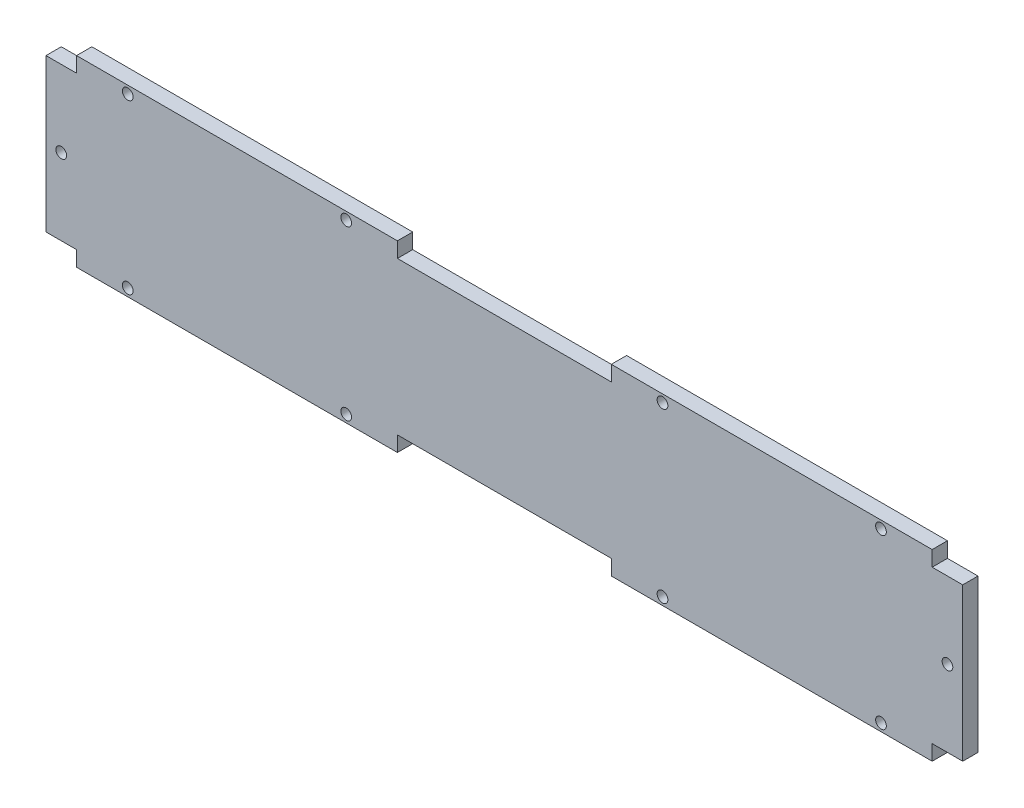
ISO-10303-21;
HEADER;
FILE_DESCRIPTION(('STEP AP214'),'2;1');
FILE_NAME('part.step','',(''),(''),'','','');
FILE_SCHEMA(('AUTOMOTIVE_DESIGN { 1 0 10303 214 1 1 1 1 }'));
ENDSEC;
DATA;
#1=APPLICATION_CONTEXT('core data for automotive mechanical design processes');
#2=APPLICATION_PROTOCOL_DEFINITION('international standard','automotive_design',2000,#1);
#3=PRODUCT_CONTEXT('',#1,'mechanical');
#4=PRODUCT('Part','Part','',(#3));
#5=PRODUCT_RELATED_PRODUCT_CATEGORY('part','',(#4));
#6=PRODUCT_DEFINITION_FORMATION('','',#4);
#7=PRODUCT_DEFINITION_CONTEXT('part definition',#1,'design');
#8=PRODUCT_DEFINITION('design','',#6,#7);
#9=PRODUCT_DEFINITION_SHAPE('','',#8);
#10=(LENGTH_UNIT() NAMED_UNIT(*) SI_UNIT(.MILLI.,.METRE.));
#11=(NAMED_UNIT(*) PLANE_ANGLE_UNIT() SI_UNIT($,.RADIAN.));
#12=(NAMED_UNIT(*) SI_UNIT($,.STERADIAN.) SOLID_ANGLE_UNIT());
#13=UNCERTAINTY_MEASURE_WITH_UNIT(LENGTH_MEASURE(1.E-05),#10,'distance_accuracy_value','');
#14=(GEOMETRIC_REPRESENTATION_CONTEXT(3) GLOBAL_UNCERTAINTY_ASSIGNED_CONTEXT((#13)) GLOBAL_UNIT_ASSIGNED_CONTEXT((#10,
#11,#12)) REPRESENTATION_CONTEXT('',''));
#15=CARTESIAN_POINT('',(0.,0.,0.));
#16=DIRECTION('',(0.,0.,1.));
#17=DIRECTION('',(1.,0.,0.));
#18=AXIS2_PLACEMENT_3D('',#15,#16,#17);
#19=CARTESIAN_POINT('',(35.,0.,5.));
#20=DIRECTION('',(-1.,0.,0.));
#21=DIRECTION('',(0.,0.,1.));
#22=AXIS2_PLACEMENT_3D('',#19,#20,#21);
#23=PLANE('',#22);
#24=DIRECTION('',(0.,1.,0.));
#25=VECTOR('',#24,1.);
#26=CARTESIAN_POINT('',(35.,0.,0.));
#27=LINE('',#26,#25);
#28=CARTESIAN_POINT('',(35.,-5.,0.));
#29=VERTEX_POINT('',#28);
#30=CARTESIAN_POINT('',(35.,0.,0.));
#31=VERTEX_POINT('',#30);
#32=EDGE_CURVE('E455',#29,#31,#27,.T.);
#33=ORIENTED_EDGE('',*,*,#32,.F.);
#34=DIRECTION('',(0.,0.,-1.));
#35=VECTOR('',#34,1.);
#36=CARTESIAN_POINT('',(35.,-5.,5.));
#37=LINE('',#36,#35);
#38=CARTESIAN_POINT('',(35.,-5.,5.));
#39=VERTEX_POINT('',#38);
#40=EDGE_CURVE('E424',#39,#29,#37,.T.);
#41=ORIENTED_EDGE('',*,*,#40,.F.);
#42=DIRECTION('',(0.,1.,0.));
#43=VECTOR('',#42,1.);
#44=CARTESIAN_POINT('',(35.,0.,5.));
#45=LINE('',#44,#43);
#46=CARTESIAN_POINT('',(35.,0.,5.));
#47=VERTEX_POINT('',#46);
#48=EDGE_CURVE('E472',#39,#47,#45,.T.);
#49=ORIENTED_EDGE('',*,*,#48,.T.);
#50=DIRECTION('',(0.,0.,-1.));
#51=VECTOR('',#50,1.);
#52=CARTESIAN_POINT('',(35.,0.,5.));
#53=LINE('',#52,#51);
#54=EDGE_CURVE('E420',#47,#31,#53,.T.);
#55=ORIENTED_EDGE('',*,*,#54,.T.);
#56=EDGE_LOOP('',(#33,#41,#49,#55));
#57=FACE_BOUND('',#56,.T.);
#58=ADVANCED_FACE('F161',(#57),#23,.T.);
#59=CARTESIAN_POINT('',(0.,-5.,5.));
#60=DIRECTION('',(0.,-1.,0.));
#61=DIRECTION('',(0.,0.,-1.));
#62=AXIS2_PLACEMENT_3D('',#59,#60,#61);
#63=PLANE('',#62);
#64=DIRECTION('',(-1.,0.,0.));
#65=VECTOR('',#64,1.);
#66=CARTESIAN_POINT('',(0.,-5.,0.));
#67=LINE('',#66,#65);
#68=CARTESIAN_POINT('',(140.,-5.,0.));
#69=VERTEX_POINT('',#68);
#70=EDGE_CURVE('E451',#69,#29,#67,.T.);
#71=ORIENTED_EDGE('',*,*,#70,.F.);
#72=DIRECTION('',(0.,0.,-1.));
#73=VECTOR('',#72,1.);
#74=CARTESIAN_POINT('',(140.,-5.,5.));
#75=LINE('',#74,#73);
#76=CARTESIAN_POINT('',(140.,-5.,5.));
#77=VERTEX_POINT('',#76);
#78=EDGE_CURVE('E428',#77,#69,#75,.T.);
#79=ORIENTED_EDGE('',*,*,#78,.F.);
#80=DIRECTION('',(-1.,0.,0.));
#81=VECTOR('',#80,1.);
#82=CARTESIAN_POINT('',(0.,-5.,5.));
#83=LINE('',#82,#81);
#84=EDGE_CURVE('E468',#77,#39,#83,.T.);
#85=ORIENTED_EDGE('',*,*,#84,.T.);
#86=ORIENTED_EDGE('',*,*,#40,.T.);
#87=EDGE_LOOP('',(#71,#79,#85,#86));
#88=FACE_BOUND('',#87,.T.);
#89=ADVANCED_FACE('F599',(#88),#63,.T.);
#90=CARTESIAN_POINT('',(140.,0.,5.));
#91=DIRECTION('',(-1.,0.,0.));
#92=DIRECTION('',(0.,0.,1.));
#93=AXIS2_PLACEMENT_3D('',#90,#91,#92);
#94=PLANE('',#93);
#95=DIRECTION('',(0.,0.,-1.));
#96=VECTOR('',#95,1.);
#97=CARTESIAN_POINT('',(140.,0.,5.));
#98=LINE('',#97,#96);
#99=CARTESIAN_POINT('',(140.,0.,5.));
#100=VERTEX_POINT('',#99);
#101=CARTESIAN_POINT('',(140.,0.,0.));
#102=VERTEX_POINT('',#101);
#103=EDGE_CURVE('E172',#100,#102,#98,.T.);
#104=ORIENTED_EDGE('',*,*,#103,.F.);
#105=DIRECTION('',(0.,1.,0.));
#106=VECTOR('',#105,1.);
#107=CARTESIAN_POINT('',(140.,0.,5.));
#108=LINE('',#107,#106);
#109=EDGE_CURVE('E464',#77,#100,#108,.T.);
#110=ORIENTED_EDGE('',*,*,#109,.F.);
#111=ORIENTED_EDGE('',*,*,#78,.T.);
#112=DIRECTION('',(0.,1.,0.));
#113=VECTOR('',#112,1.);
#114=CARTESIAN_POINT('',(140.,0.,0.));
#115=LINE('',#114,#113);
#116=EDGE_CURVE('E447',#69,#102,#115,.T.);
#117=ORIENTED_EDGE('',*,*,#116,.T.);
#118=EDGE_LOOP('',(#104,#110,#111,#117));
#119=FACE_BOUND('',#118,.T.);
#120=ADVANCED_FACE('F625',(#119),#94,.F.);
#121=CARTESIAN_POINT('',(0.,50.,5.));
#122=DIRECTION('',(0.,1.,0.));
#123=DIRECTION('',(0.,0.,1.));
#124=AXIS2_PLACEMENT_3D('',#121,#122,#123);
#125=PLANE('',#124);
#126=DIRECTION('',(0.,0.,-1.));
#127=VECTOR('',#126,1.);
#128=CARTESIAN_POINT('',(-35.,50.,5.));
#129=LINE('',#128,#127);
#130=CARTESIAN_POINT('',(-35.,50.,5.));
#131=VERTEX_POINT('',#130);
#132=CARTESIAN_POINT('',(-35.,50.,0.));
#133=VERTEX_POINT('',#132);
#134=EDGE_CURVE('E416',#131,#133,#129,.T.);
#135=ORIENTED_EDGE('',*,*,#134,.F.);
#136=DIRECTION('',(1.,0.,0.));
#137=VECTOR('',#136,1.);
#138=CARTESIAN_POINT('',(0.,50.,5.));
#139=LINE('',#138,#137);
#140=CARTESIAN_POINT('',(35.,50.,5.));
#141=VERTEX_POINT('',#140);
#142=EDGE_CURVE('E442',#131,#141,#139,.T.);
#143=ORIENTED_EDGE('',*,*,#142,.T.);
#144=DIRECTION('',(0.,0.,-1.));
#145=VECTOR('',#144,1.);
#146=CARTESIAN_POINT('',(35.,50.,5.));
#147=LINE('',#146,#145);
#148=CARTESIAN_POINT('',(35.,50.,0.));
#149=VERTEX_POINT('',#148);
#150=EDGE_CURVE('E165',#141,#149,#147,.T.);
#151=ORIENTED_EDGE('',*,*,#150,.T.);
#152=DIRECTION('',(1.,0.,0.));
#153=VECTOR('',#152,1.);
#154=CARTESIAN_POINT('',(0.,50.,0.));
#155=LINE('',#154,#153);
#156=EDGE_CURVE('E443',#133,#149,#155,.T.);
#157=ORIENTED_EDGE('',*,*,#156,.F.);
#158=EDGE_LOOP('',(#135,#143,#151,#157));
#159=FACE_BOUND('',#158,.T.);
#160=ADVANCED_FACE('F684',(#159),#125,.T.);
#161=CARTESIAN_POINT('',(0.,0.,5.));
#162=DIRECTION('',(0.,-1.,0.));
#163=DIRECTION('',(0.,0.,-1.));
#164=AXIS2_PLACEMENT_3D('',#161,#162,#163);
#165=PLANE('',#164);
#166=DIRECTION('',(-1.,0.,0.));
#167=VECTOR('',#166,1.);
#168=CARTESIAN_POINT('',(0.,0.,5.));
#169=LINE('',#168,#167);
#170=CARTESIAN_POINT('',(-35.,0.,5.));
#171=VERTEX_POINT('',#170);
#172=EDGE_CURVE('E446',#47,#171,#169,.T.);
#173=ORIENTED_EDGE('',*,*,#172,.T.);
#174=DIRECTION('',(0.,0.,-1.));
#175=VECTOR('',#174,1.);
#176=CARTESIAN_POINT('',(-35.,0.,5.));
#177=LINE('',#176,#175);
#178=CARTESIAN_POINT('',(-35.,0.,0.));
#179=VERTEX_POINT('',#178);
#180=EDGE_CURVE('E12',#171,#179,#177,.T.);
#181=ORIENTED_EDGE('',*,*,#180,.T.);
#182=DIRECTION('',(-1.,0.,0.));
#183=VECTOR('',#182,1.);
#184=CARTESIAN_POINT('',(0.,0.,0.));
#185=LINE('',#184,#183);
#186=EDGE_CURVE('E392',#31,#179,#185,.T.);
#187=ORIENTED_EDGE('',*,*,#186,.F.);
#188=ORIENTED_EDGE('',*,*,#54,.F.);
#189=EDGE_LOOP('',(#173,#181,#187,#188));
#190=FACE_BOUND('',#189,.T.);
#191=ADVANCED_FACE('F662',(#190),#165,.T.);
#192=CARTESIAN_POINT('',(0.,0.,0.));
#193=DIRECTION('',(0.,0.,1.));
#194=DIRECTION('',(1.,0.,0.));
#195=AXIS2_PLACEMENT_3D('',#192,#193,#194);
#196=PLANE('',#195);
#197=CARTESIAN_POINT('',(-145.,25.,0.));
#198=DIRECTION('',(0.,0.,1.));
#199=DIRECTION('',(1.,0.,0.));
#200=AXIS2_PLACEMENT_3D('',#197,#198,#199);
#201=CIRCLE('',#200,1.75000000000001);
#202=CARTESIAN_POINT('',(-143.25,25.,0.));
#203=VERTEX_POINT('',#202);
#204=EDGE_CURVE('E520',#203,#203,#201,.T.);
#205=ORIENTED_EDGE('',*,*,#204,.T.);
#206=EDGE_LOOP('',(#205));
#207=FACE_BOUND('',#206,.T.);
#208=CARTESIAN_POINT('',(145.,25.0000000000009,0.));
#209=DIRECTION('',(0.,0.,1.));
#210=DIRECTION('',(1.,0.,0.));
#211=AXIS2_PLACEMENT_3D('',#208,#209,#210);
#212=CIRCLE('',#211,1.75000000000001);
#213=CARTESIAN_POINT('',(146.75,25.0000000000009,0.));
#214=VERTEX_POINT('',#213);
#215=EDGE_CURVE('E542',#214,#214,#212,.T.);
#216=ORIENTED_EDGE('',*,*,#215,.T.);
#217=EDGE_LOOP('',(#216));
#218=FACE_BOUND('',#217,.T.);
#219=CARTESIAN_POINT('',(-51.75,-2.49999999999999,0.));
#220=DIRECTION('',(0.,0.,1.));
#221=DIRECTION('',(-1.,0.,0.));
#222=AXIS2_PLACEMENT_3D('',#219,#220,#221);
#223=CIRCLE('',#222,1.75000000000001);
#224=CARTESIAN_POINT('',(-53.5000000000001,-2.49999999999999,0.));
#225=VERTEX_POINT('',#224);
#226=EDGE_CURVE('E481',#225,#225,#223,.T.);
#227=ORIENTED_EDGE('',*,*,#226,.T.);
#228=EDGE_LOOP('',(#227));
#229=FACE_BOUND('',#228,.T.);
#230=CARTESIAN_POINT('',(51.75,-2.49999999999999,0.));
#231=DIRECTION('',(0.,0.,1.));
#232=DIRECTION('',(1.,0.,0.));
#233=AXIS2_PLACEMENT_3D('',#230,#231,#232);
#234=CIRCLE('',#233,1.75);
#235=CARTESIAN_POINT('',(53.5,-2.49999999999999,0.));
#236=VERTEX_POINT('',#235);
#237=EDGE_CURVE('E504',#236,#236,#234,.T.);
#238=ORIENTED_EDGE('',*,*,#237,.T.);
#239=EDGE_LOOP('',(#238));
#240=FACE_BOUND('',#239,.T.);
#241=CARTESIAN_POINT('',(123.25,-2.49999999999999,0.));
#242=DIRECTION('',(0.,0.,1.));
#243=DIRECTION('',(-1.,0.,0.));
#244=AXIS2_PLACEMENT_3D('',#241,#242,#243);
#245=CIRCLE('',#244,1.75);
#246=CARTESIAN_POINT('',(121.5,-2.49999999999999,0.));
#247=VERTEX_POINT('',#246);
#248=EDGE_CURVE('E496',#247,#247,#245,.T.);
#249=ORIENTED_EDGE('',*,*,#248,.T.);
#250=EDGE_LOOP('',(#249));
#251=FACE_BOUND('',#250,.T.);
#252=CARTESIAN_POINT('',(123.25,52.5,0.));
#253=DIRECTION('',(0.,0.,1.));
#254=DIRECTION('',(1.,0.,0.));
#255=AXIS2_PLACEMENT_3D('',#252,#253,#254);
#256=CIRCLE('',#255,1.75);
#257=CARTESIAN_POINT('',(125.,52.5,0.));
#258=VERTEX_POINT('',#257);
#259=EDGE_CURVE('E487',#258,#258,#256,.T.);
#260=ORIENTED_EDGE('',*,*,#259,.T.);
#261=EDGE_LOOP('',(#260));
#262=FACE_BOUND('',#261,.T.);
#263=CARTESIAN_POINT('',(51.75,52.5,0.));
#264=DIRECTION('',(0.,0.,1.));
#265=DIRECTION('',(-1.,0.,0.));
#266=AXIS2_PLACEMENT_3D('',#263,#264,#265);
#267=CIRCLE('',#266,1.75);
#268=CARTESIAN_POINT('',(50.,52.5,0.));
#269=VERTEX_POINT('',#268);
#270=EDGE_CURVE('E488',#269,#269,#267,.T.);
#271=ORIENTED_EDGE('',*,*,#270,.T.);
#272=EDGE_LOOP('',(#271));
#273=FACE_BOUND('',#272,.T.);
#274=CARTESIAN_POINT('',(-51.75,52.5,0.));
#275=DIRECTION('',(0.,0.,1.));
#276=DIRECTION('',(1.,0.,0.));
#277=AXIS2_PLACEMENT_3D('',#274,#275,#276);
#278=CIRCLE('',#277,1.75000000000001);
#279=CARTESIAN_POINT('',(-50.,52.5,0.));
#280=VERTEX_POINT('',#279);
#281=EDGE_CURVE('E528',#280,#280,#278,.T.);
#282=ORIENTED_EDGE('',*,*,#281,.T.);
#283=EDGE_LOOP('',(#282));
#284=FACE_BOUND('',#283,.T.);
#285=CARTESIAN_POINT('',(-123.25,52.5,0.));
#286=DIRECTION('',(0.,0.,1.));
#287=DIRECTION('',(-1.,0.,0.));
#288=AXIS2_PLACEMENT_3D('',#285,#286,#287);
#289=CIRCLE('',#288,1.75000000000001);
#290=CARTESIAN_POINT('',(-125.,52.5,0.));
#291=VERTEX_POINT('',#290);
#292=EDGE_CURVE('E519',#291,#291,#289,.T.);
#293=ORIENTED_EDGE('',*,*,#292,.T.);
#294=EDGE_LOOP('',(#293));
#295=FACE_BOUND('',#294,.T.);
#296=CARTESIAN_POINT('',(-123.25,-2.49999999999999,0.));
#297=DIRECTION('',(0.,0.,1.));
#298=DIRECTION('',(1.,0.,0.));
#299=AXIS2_PLACEMENT_3D('',#296,#297,#298);
#300=CIRCLE('',#299,1.75000000000001);
#301=CARTESIAN_POINT('',(-121.5,-2.49999999999999,0.));
#302=VERTEX_POINT('',#301);
#303=EDGE_CURVE('E278',#302,#302,#300,.T.);
#304=ORIENTED_EDGE('',*,*,#303,.T.);
#305=EDGE_LOOP('',(#304));
#306=FACE_BOUND('',#305,.T.);
#307=DIRECTION('',(0.,-1.,0.));
#308=VECTOR('',#307,1.);
#309=CARTESIAN_POINT('',(140.,55.,0.));
#310=LINE('',#309,#308);
#311=CARTESIAN_POINT('',(140.,55.,0.));
#312=VERTEX_POINT('',#311);
#313=CARTESIAN_POINT('',(140.,50.,0.));
#314=VERTEX_POINT('',#313);
#315=EDGE_CURVE('E267',#312,#314,#310,.T.);
#316=ORIENTED_EDGE('',*,*,#315,.T.);
#317=DIRECTION('',(1.,0.,0.));
#318=VECTOR('',#317,1.);
#319=CARTESIAN_POINT('',(140.,50.,0.));
#320=LINE('',#319,#318);
#321=CARTESIAN_POINT('',(150.,50.,0.));
#322=VERTEX_POINT('',#321);
#323=EDGE_CURVE('E301',#314,#322,#320,.T.);
#324=ORIENTED_EDGE('',*,*,#323,.T.);
#325=DIRECTION('',(0.,1.,0.));
#326=VECTOR('',#325,1.);
#327=CARTESIAN_POINT('',(150.,0.,0.));
#328=LINE('',#327,#326);
#329=CARTESIAN_POINT('',(150.,0.,0.));
#330=VERTEX_POINT('',#329);
#331=EDGE_CURVE('E341',#330,#322,#328,.T.);
#332=ORIENTED_EDGE('',*,*,#331,.F.);
#333=DIRECTION('',(1.,0.,0.));
#334=VECTOR('',#333,1.);
#335=CARTESIAN_POINT('',(140.,0.,0.));
#336=LINE('',#335,#334);
#337=EDGE_CURVE('E337',#102,#330,#336,.T.);
#338=ORIENTED_EDGE('',*,*,#337,.F.);
#339=ORIENTED_EDGE('',*,*,#116,.F.);
#340=ORIENTED_EDGE('',*,*,#70,.T.);
#341=ORIENTED_EDGE('',*,*,#32,.T.);
#342=ORIENTED_EDGE('',*,*,#186,.T.);
#343=DIRECTION('',(0.,1.,0.));
#344=VECTOR('',#343,1.);
#345=CARTESIAN_POINT('',(-35.,-5.,0.));
#346=LINE('',#345,#344);
#347=CARTESIAN_POINT('',(-35.,-5.,0.));
#348=VERTEX_POINT('',#347);
#349=EDGE_CURVE('E358',#348,#179,#346,.T.);
#350=ORIENTED_EDGE('',*,*,#349,.F.);
#351=DIRECTION('',(1.,0.,0.));
#352=VECTOR('',#351,1.);
#353=CARTESIAN_POINT('',(-140.,-5.,0.));
#354=LINE('',#353,#352);
#355=CARTESIAN_POINT('',(-140.,-5.,0.));
#356=VERTEX_POINT('',#355);
#357=EDGE_CURVE('E398',#356,#348,#354,.T.);
#358=ORIENTED_EDGE('',*,*,#357,.F.);
#359=DIRECTION('',(0.,1.,0.));
#360=VECTOR('',#359,1.);
#361=CARTESIAN_POINT('',(-140.,-5.,0.));
#362=LINE('',#361,#360);
#363=CARTESIAN_POINT('',(-140.,0.,0.));
#364=VERTEX_POINT('',#363);
#365=EDGE_CURVE('E393',#356,#364,#362,.T.);
#366=ORIENTED_EDGE('',*,*,#365,.T.);
#367=DIRECTION('',(-1.,0.,0.));
#368=VECTOR('',#367,1.);
#369=CARTESIAN_POINT('',(-140.,0.,0.));
#370=LINE('',#369,#368);
#371=CARTESIAN_POINT('',(-150.,0.,0.));
#372=VERTEX_POINT('',#371);
#373=EDGE_CURVE('E363',#364,#372,#370,.T.);
#374=ORIENTED_EDGE('',*,*,#373,.T.);
#375=DIRECTION('',(0.,1.,0.));
#376=VECTOR('',#375,1.);
#377=CARTESIAN_POINT('',(-150.,0.,0.));
#378=LINE('',#377,#376);
#379=CARTESIAN_POINT('',(-150.,50.,0.));
#380=VERTEX_POINT('',#379);
#381=EDGE_CURVE('E368',#372,#380,#378,.T.);
#382=ORIENTED_EDGE('',*,*,#381,.T.);
#383=DIRECTION('',(-1.,0.,0.));
#384=VECTOR('',#383,1.);
#385=CARTESIAN_POINT('',(-140.,50.,0.));
#386=LINE('',#385,#384);
#387=CARTESIAN_POINT('',(-140.,50.,0.));
#388=VERTEX_POINT('',#387);
#389=EDGE_CURVE('E336',#388,#380,#386,.T.);
#390=ORIENTED_EDGE('',*,*,#389,.F.);
#391=DIRECTION('',(0.,-1.,0.));
#392=VECTOR('',#391,1.);
#393=CARTESIAN_POINT('',(-140.,55.,0.));
#394=LINE('',#393,#392);
#395=CARTESIAN_POINT('',(-140.,55.,0.));
#396=VERTEX_POINT('',#395);
#397=EDGE_CURVE('E258',#396,#388,#394,.T.);
#398=ORIENTED_EDGE('',*,*,#397,.F.);
#399=DIRECTION('',(1.,0.,0.));
#400=VECTOR('',#399,1.);
#401=CARTESIAN_POINT('',(-140.,55.,0.));
#402=LINE('',#401,#400);
#403=CARTESIAN_POINT('',(-35.,55.,0.));
#404=VERTEX_POINT('',#403);
#405=EDGE_CURVE('E306',#396,#404,#402,.T.);
#406=ORIENTED_EDGE('',*,*,#405,.T.);
#407=DIRECTION('',(0.,-1.,0.));
#408=VECTOR('',#407,1.);
#409=CARTESIAN_POINT('',(-35.,55.,0.));
#410=LINE('',#409,#408);
#411=EDGE_CURVE('E311',#404,#133,#410,.T.);
#412=ORIENTED_EDGE('',*,*,#411,.T.);
#413=ORIENTED_EDGE('',*,*,#156,.T.);
#414=DIRECTION('',(0.,-1.,0.));
#415=VECTOR('',#414,1.);
#416=CARTESIAN_POINT('',(35.,55.,0.));
#417=LINE('',#416,#415);
#418=CARTESIAN_POINT('',(35.,55.,0.));
#419=VERTEX_POINT('',#418);
#420=EDGE_CURVE('E269',#419,#149,#417,.T.);
#421=ORIENTED_EDGE('',*,*,#420,.F.);
#422=DIRECTION('',(-1.,0.,0.));
#423=VECTOR('',#422,1.);
#424=CARTESIAN_POINT('',(140.,55.,0.));
#425=LINE('',#424,#423);
#426=EDGE_CURVE('E247',#312,#419,#425,.T.);
#427=ORIENTED_EDGE('',*,*,#426,.F.);
#428=EDGE_LOOP('',(#316,#324,#332,#338,#339,#340,#341,#342,#350,#358,#366,#374,#382,#390,#398,
#406,#412,#413,#421,#427));
#429=FACE_BOUND('',#428,.T.);
#430=ADVANCED_FACE('F264',(#207,#218,#229,#240,#251,#262,#273,#284,#295,#306,#429),#196,.F.);
#431=CARTESIAN_POINT('',(0.,0.,5.));
#432=DIRECTION('',(0.,0.,1.));
#433=DIRECTION('',(1.,0.,0.));
#434=AXIS2_PLACEMENT_3D('',#431,#432,#433);
#435=PLANE('',#434);
#436=CARTESIAN_POINT('',(-145.,25.,5.));
#437=DIRECTION('',(0.,0.,1.));
#438=DIRECTION('',(1.,0.,0.));
#439=AXIS2_PLACEMENT_3D('',#436,#437,#438);
#440=CIRCLE('',#439,1.75000000000001);
#441=CARTESIAN_POINT('',(-143.25,25.,5.));
#442=VERTEX_POINT('',#441);
#443=EDGE_CURVE('E546',#442,#442,#440,.T.);
#444=ORIENTED_EDGE('',*,*,#443,.F.);
#445=EDGE_LOOP('',(#444));
#446=FACE_BOUND('',#445,.T.);
#447=CARTESIAN_POINT('',(145.,25.0000000000009,5.));
#448=DIRECTION('',(0.,0.,1.));
#449=DIRECTION('',(-1.,0.,0.));
#450=AXIS2_PLACEMENT_3D('',#447,#448,#449);
#451=CIRCLE('',#450,1.75000000000001);
#452=CARTESIAN_POINT('',(143.25,25.0000000000009,5.));
#453=VERTEX_POINT('',#452);
#454=EDGE_CURVE('E547',#453,#453,#451,.T.);
#455=ORIENTED_EDGE('',*,*,#454,.F.);
#456=EDGE_LOOP('',(#455));
#457=FACE_BOUND('',#456,.T.);
#458=CARTESIAN_POINT('',(-51.75,-2.49999999999999,5.));
#459=DIRECTION('',(0.,0.,1.));
#460=DIRECTION('',(-1.,0.,0.));
#461=AXIS2_PLACEMENT_3D('',#458,#459,#460);
#462=CIRCLE('',#461,1.75000000000001);
#463=CARTESIAN_POINT('',(-53.5000000000001,-2.49999999999999,5.));
#464=VERTEX_POINT('',#463);
#465=EDGE_CURVE('E508',#464,#464,#462,.T.);
#466=ORIENTED_EDGE('',*,*,#465,.F.);
#467=EDGE_LOOP('',(#466));
#468=FACE_BOUND('',#467,.T.);
#469=CARTESIAN_POINT('',(51.75,-2.49999999999999,5.));
#470=DIRECTION('',(0.,0.,1.));
#471=DIRECTION('',(1.,0.,0.));
#472=AXIS2_PLACEMENT_3D('',#469,#470,#471);
#473=CIRCLE('',#472,1.75);
#474=CARTESIAN_POINT('',(53.5,-2.49999999999999,5.));
#475=VERTEX_POINT('',#474);
#476=EDGE_CURVE('E500',#475,#475,#473,.T.);
#477=ORIENTED_EDGE('',*,*,#476,.F.);
#478=EDGE_LOOP('',(#477));
#479=FACE_BOUND('',#478,.T.);
#480=CARTESIAN_POINT('',(123.25,-2.49999999999999,5.));
#481=DIRECTION('',(0.,0.,1.));
#482=DIRECTION('',(-1.,0.,0.));
#483=AXIS2_PLACEMENT_3D('',#480,#481,#482);
#484=CIRCLE('',#483,1.75);
#485=CARTESIAN_POINT('',(121.5,-2.49999999999999,5.));
#486=VERTEX_POINT('',#485);
#487=EDGE_CURVE('E492',#486,#486,#484,.T.);
#488=ORIENTED_EDGE('',*,*,#487,.F.);
#489=EDGE_LOOP('',(#488));
#490=FACE_BOUND('',#489,.T.);
#491=CARTESIAN_POINT('',(123.25,52.5,5.));
#492=DIRECTION('',(0.,0.,1.));
#493=DIRECTION('',(1.,0.,0.));
#494=AXIS2_PLACEMENT_3D('',#491,#492,#493);
#495=CIRCLE('',#494,1.75);
#496=CARTESIAN_POINT('',(125.,52.5,5.));
#497=VERTEX_POINT('',#496);
#498=EDGE_CURVE('E483',#497,#497,#495,.T.);
#499=ORIENTED_EDGE('',*,*,#498,.F.);
#500=EDGE_LOOP('',(#499));
#501=FACE_BOUND('',#500,.T.);
#502=CARTESIAN_POINT('',(51.75,52.5,5.));
#503=DIRECTION('',(0.,0.,1.));
#504=DIRECTION('',(-1.,0.,0.));
#505=AXIS2_PLACEMENT_3D('',#502,#503,#504);
#506=CIRCLE('',#505,1.75);
#507=CARTESIAN_POINT('',(50.,52.5,5.));
#508=VERTEX_POINT('',#507);
#509=EDGE_CURVE('E532',#508,#508,#506,.T.);
#510=ORIENTED_EDGE('',*,*,#509,.F.);
#511=EDGE_LOOP('',(#510));
#512=FACE_BOUND('',#511,.T.);
#513=CARTESIAN_POINT('',(-51.75,52.5,5.));
#514=DIRECTION('',(0.,0.,1.));
#515=DIRECTION('',(1.,0.,0.));
#516=AXIS2_PLACEMENT_3D('',#513,#514,#515);
#517=CIRCLE('',#516,1.75000000000001);
#518=CARTESIAN_POINT('',(-50.,52.5,5.));
#519=VERTEX_POINT('',#518);
#520=EDGE_CURVE('E524',#519,#519,#517,.T.);
#521=ORIENTED_EDGE('',*,*,#520,.F.);
#522=EDGE_LOOP('',(#521));
#523=FACE_BOUND('',#522,.T.);
#524=CARTESIAN_POINT('',(-123.25,52.5,5.));
#525=DIRECTION('',(0.,0.,1.));
#526=DIRECTION('',(-1.,0.,0.));
#527=AXIS2_PLACEMENT_3D('',#524,#525,#526);
#528=CIRCLE('',#527,1.75000000000001);
#529=CARTESIAN_POINT('',(-125.,52.5,5.));
#530=VERTEX_POINT('',#529);
#531=EDGE_CURVE('E515',#530,#530,#528,.T.);
#532=ORIENTED_EDGE('',*,*,#531,.F.);
#533=EDGE_LOOP('',(#532));
#534=FACE_BOUND('',#533,.T.);
#535=CARTESIAN_POINT('',(-123.25,-2.49999999999999,5.));
#536=DIRECTION('',(0.,0.,1.));
#537=DIRECTION('',(1.,0.,0.));
#538=AXIS2_PLACEMENT_3D('',#535,#536,#537);
#539=CIRCLE('',#538,1.75000000000001);
#540=CARTESIAN_POINT('',(-121.5,-2.49999999999999,5.));
#541=VERTEX_POINT('',#540);
#542=EDGE_CURVE('E284',#541,#541,#539,.T.);
#543=ORIENTED_EDGE('',*,*,#542,.F.);
#544=EDGE_LOOP('',(#543));
#545=FACE_BOUND('',#544,.T.);
#546=ORIENTED_EDGE('',*,*,#172,.F.);
#547=ORIENTED_EDGE('',*,*,#48,.F.);
#548=ORIENTED_EDGE('',*,*,#84,.F.);
#549=ORIENTED_EDGE('',*,*,#109,.T.);
#550=DIRECTION('',(1.,0.,0.));
#551=VECTOR('',#550,1.);
#552=CARTESIAN_POINT('',(140.,0.,5.));
#553=LINE('',#552,#551);
#554=CARTESIAN_POINT('',(150.,0.,5.));
#555=VERTEX_POINT('',#554);
#556=EDGE_CURVE('E332',#100,#555,#553,.T.);
#557=ORIENTED_EDGE('',*,*,#556,.T.);
#558=DIRECTION('',(0.,1.,0.));
#559=VECTOR('',#558,1.);
#560=CARTESIAN_POINT('',(150.,0.,5.));
#561=LINE('',#560,#559);
#562=CARTESIAN_POINT('',(150.,50.,5.));
#563=VERTEX_POINT('',#562);
#564=EDGE_CURVE('E349',#555,#563,#561,.T.);
#565=ORIENTED_EDGE('',*,*,#564,.T.);
#566=DIRECTION('',(1.,0.,0.));
#567=VECTOR('',#566,1.);
#568=CARTESIAN_POINT('',(140.,50.,5.));
#569=LINE('',#568,#567);
#570=CARTESIAN_POINT('',(140.,50.,5.));
#571=VERTEX_POINT('',#570);
#572=EDGE_CURVE('E340',#571,#563,#569,.T.);
#573=ORIENTED_EDGE('',*,*,#572,.F.);
#574=DIRECTION('',(0.,-1.,0.));
#575=VECTOR('',#574,1.);
#576=CARTESIAN_POINT('',(140.,55.,5.));
#577=LINE('',#576,#575);
#578=CARTESIAN_POINT('',(140.,55.,5.));
#579=VERTEX_POINT('',#578);
#580=EDGE_CURVE('E271',#579,#571,#577,.T.);
#581=ORIENTED_EDGE('',*,*,#580,.F.);
#582=DIRECTION('',(-1.,0.,0.));
#583=VECTOR('',#582,1.);
#584=CARTESIAN_POINT('',(140.,55.,5.));
#585=LINE('',#584,#583);
#586=CARTESIAN_POINT('',(35.,55.,5.));
#587=VERTEX_POINT('',#586);
#588=EDGE_CURVE('E252',#579,#587,#585,.T.);
#589=ORIENTED_EDGE('',*,*,#588,.T.);
#590=DIRECTION('',(0.,-1.,0.));
#591=VECTOR('',#590,1.);
#592=CARTESIAN_POINT('',(35.,55.,5.));
#593=LINE('',#592,#591);
#594=EDGE_CURVE('E290',#587,#141,#593,.T.);
#595=ORIENTED_EDGE('',*,*,#594,.T.);
#596=ORIENTED_EDGE('',*,*,#142,.F.);
#597=DIRECTION('',(0.,-1.,0.));
#598=VECTOR('',#597,1.);
#599=CARTESIAN_POINT('',(-35.,55.,5.));
#600=LINE('',#599,#598);
#601=CARTESIAN_POINT('',(-35.,55.,5.));
#602=VERTEX_POINT('',#601);
#603=EDGE_CURVE('E321',#602,#131,#600,.T.);
#604=ORIENTED_EDGE('',*,*,#603,.F.);
#605=DIRECTION('',(1.,0.,0.));
#606=VECTOR('',#605,1.);
#607=CARTESIAN_POINT('',(-140.,55.,5.));
#608=LINE('',#607,#606);
#609=CARTESIAN_POINT('',(-140.,55.,5.));
#610=VERTEX_POINT('',#609);
#611=EDGE_CURVE('E305',#610,#602,#608,.T.);
#612=ORIENTED_EDGE('',*,*,#611,.F.);
#613=DIRECTION('',(0.,-1.,0.));
#614=VECTOR('',#613,1.);
#615=CARTESIAN_POINT('',(-140.,55.,5.));
#616=LINE('',#615,#614);
#617=CARTESIAN_POINT('',(-140.,50.,5.));
#618=VERTEX_POINT('',#617);
#619=EDGE_CURVE('E310',#610,#618,#616,.T.);
#620=ORIENTED_EDGE('',*,*,#619,.T.);
#621=DIRECTION('',(-1.,0.,0.));
#622=VECTOR('',#621,1.);
#623=CARTESIAN_POINT('',(-140.,50.,5.));
#624=LINE('',#623,#622);
#625=CARTESIAN_POINT('',(-150.,50.,5.));
#626=VERTEX_POINT('',#625);
#627=EDGE_CURVE('E367',#618,#626,#624,.T.);
#628=ORIENTED_EDGE('',*,*,#627,.T.);
#629=DIRECTION('',(0.,1.,0.));
#630=VECTOR('',#629,1.);
#631=CARTESIAN_POINT('',(-150.,0.,5.));
#632=LINE('',#631,#630);
#633=CARTESIAN_POINT('',(-150.,0.,5.));
#634=VERTEX_POINT('',#633);
#635=EDGE_CURVE('E378',#634,#626,#632,.T.);
#636=ORIENTED_EDGE('',*,*,#635,.F.);
#637=DIRECTION('',(-1.,0.,0.));
#638=VECTOR('',#637,1.);
#639=CARTESIAN_POINT('',(-140.,0.,5.));
#640=LINE('',#639,#638);
#641=CARTESIAN_POINT('',(-140.,0.,5.));
#642=VERTEX_POINT('',#641);
#643=EDGE_CURVE('E362',#642,#634,#640,.T.);
#644=ORIENTED_EDGE('',*,*,#643,.F.);
#645=DIRECTION('',(0.,1.,0.));
#646=VECTOR('',#645,1.);
#647=CARTESIAN_POINT('',(-140.,-5.,5.));
#648=LINE('',#647,#646);
#649=CARTESIAN_POINT('',(-140.,-5.,5.));
#650=VERTEX_POINT('',#649);
#651=EDGE_CURVE('E389',#650,#642,#648,.T.);
#652=ORIENTED_EDGE('',*,*,#651,.F.);
#653=DIRECTION('',(1.,0.,0.));
#654=VECTOR('',#653,1.);
#655=CARTESIAN_POINT('',(-140.,-5.,5.));
#656=LINE('',#655,#654);
#657=CARTESIAN_POINT('',(-35.,-5.,5.));
#658=VERTEX_POINT('',#657);
#659=EDGE_CURVE('E407',#650,#658,#656,.T.);
#660=ORIENTED_EDGE('',*,*,#659,.T.);
#661=DIRECTION('',(0.,1.,0.));
#662=VECTOR('',#661,1.);
#663=CARTESIAN_POINT('',(-35.,-5.,5.));
#664=LINE('',#663,#662);
#665=EDGE_CURVE('E397',#658,#171,#664,.T.);
#666=ORIENTED_EDGE('',*,*,#665,.T.);
#667=EDGE_LOOP('',(#546,#547,#548,#549,#557,#565,#573,#581,#589,#595,#596,#604,#612,#620,#628,
#636,#644,#652,#660,#666));
#668=FACE_BOUND('',#667,.T.);
#669=ADVANCED_FACE('F558',(#446,#457,#468,#479,#490,#501,#512,#523,#534,#545,#668),#435,.T.);
#670=CARTESIAN_POINT('',(140.,55.,5.));
#671=DIRECTION('',(0.,-1.,0.));
#672=DIRECTION('',(0.,0.,-1.));
#673=AXIS2_PLACEMENT_3D('',#670,#671,#672);
#674=PLANE('',#673);
#675=ORIENTED_EDGE('',*,*,#426,.T.);
#676=DIRECTION('',(0.,0.,-1.));
#677=VECTOR('',#676,1.);
#678=CARTESIAN_POINT('',(35.,55.,5.));
#679=LINE('',#678,#677);
#680=EDGE_CURVE('E259',#587,#419,#679,.T.);
#681=ORIENTED_EDGE('',*,*,#680,.F.);
#682=ORIENTED_EDGE('',*,*,#588,.F.);
#683=DIRECTION('',(0.,0.,-1.));
#684=VECTOR('',#683,1.);
#685=CARTESIAN_POINT('',(140.,55.,5.));
#686=LINE('',#685,#684);
#687=EDGE_CURVE('E250',#579,#312,#686,.T.);
#688=ORIENTED_EDGE('',*,*,#687,.T.);
#689=EDGE_LOOP('',(#675,#681,#682,#688));
#690=FACE_BOUND('',#689,.T.);
#691=ADVANCED_FACE('F251',(#690),#674,.F.);
#692=CARTESIAN_POINT('',(35.,55.,5.));
#693=DIRECTION('',(1.,0.,0.));
#694=DIRECTION('',(0.,0.,-1.));
#695=AXIS2_PLACEMENT_3D('',#692,#693,#694);
#696=PLANE('',#695);
#697=ORIENTED_EDGE('',*,*,#420,.T.);
#698=ORIENTED_EDGE('',*,*,#150,.F.);
#699=ORIENTED_EDGE('',*,*,#594,.F.);
#700=ORIENTED_EDGE('',*,*,#680,.T.);
#701=EDGE_LOOP('',(#697,#698,#699,#700));
#702=FACE_BOUND('',#701,.T.);
#703=ADVANCED_FACE('F718',(#702),#696,.F.);
#704=CARTESIAN_POINT('',(140.,55.,5.));
#705=DIRECTION('',(1.,0.,0.));
#706=DIRECTION('',(0.,0.,-1.));
#707=AXIS2_PLACEMENT_3D('',#704,#705,#706);
#708=PLANE('',#707);
#709=ORIENTED_EDGE('',*,*,#315,.F.);
#710=ORIENTED_EDGE('',*,*,#687,.F.);
#711=ORIENTED_EDGE('',*,*,#580,.T.);
#712=DIRECTION('',(0.,0.,-1.));
#713=VECTOR('',#712,1.);
#714=CARTESIAN_POINT('',(140.,50.,5.));
#715=LINE('',#714,#713);
#716=EDGE_CURVE('E275',#571,#314,#715,.T.);
#717=ORIENTED_EDGE('',*,*,#716,.T.);
#718=EDGE_LOOP('',(#709,#710,#711,#717));
#719=FACE_BOUND('',#718,.T.);
#720=ADVANCED_FACE('F163',(#719),#708,.T.);
#721=CARTESIAN_POINT('',(140.,0.,5.));
#722=DIRECTION('',(0.,1.,0.));
#723=DIRECTION('',(0.,0.,1.));
#724=AXIS2_PLACEMENT_3D('',#721,#722,#723);
#725=PLANE('',#724);
#726=ORIENTED_EDGE('',*,*,#337,.T.);
#727=DIRECTION('',(0.,0.,-1.));
#728=VECTOR('',#727,1.);
#729=CARTESIAN_POINT('',(150.,0.,5.));
#730=LINE('',#729,#728);
#731=EDGE_CURVE('E331',#555,#330,#730,.T.);
#732=ORIENTED_EDGE('',*,*,#731,.F.);
#733=ORIENTED_EDGE('',*,*,#556,.F.);
#734=ORIENTED_EDGE('',*,*,#103,.T.);
#735=EDGE_LOOP('',(#726,#732,#733,#734));
#736=FACE_BOUND('',#735,.T.);
#737=ADVANCED_FACE('F630',(#736),#725,.F.);
#738=CARTESIAN_POINT('',(150.,0.,5.));
#739=DIRECTION('',(-1.,0.,0.));
#740=DIRECTION('',(0.,0.,1.));
#741=AXIS2_PLACEMENT_3D('',#738,#739,#740);
#742=PLANE('',#741);
#743=ORIENTED_EDGE('',*,*,#331,.T.);
#744=DIRECTION('',(0.,0.,-1.));
#745=VECTOR('',#744,1.);
#746=CARTESIAN_POINT('',(150.,50.,5.));
#747=LINE('',#746,#745);
#748=EDGE_CURVE('E328',#563,#322,#747,.T.);
#749=ORIENTED_EDGE('',*,*,#748,.F.);
#750=ORIENTED_EDGE('',*,*,#564,.F.);
#751=ORIENTED_EDGE('',*,*,#731,.T.);
#752=EDGE_LOOP('',(#743,#749,#750,#751));
#753=FACE_BOUND('',#752,.T.);
#754=ADVANCED_FACE('F665',(#753),#742,.F.);
#755=CARTESIAN_POINT('',(140.,50.,5.));
#756=DIRECTION('',(0.,1.,0.));
#757=DIRECTION('',(0.,0.,1.));
#758=AXIS2_PLACEMENT_3D('',#755,#756,#757);
#759=PLANE('',#758);
#760=ORIENTED_EDGE('',*,*,#323,.F.);
#761=ORIENTED_EDGE('',*,*,#716,.F.);
#762=ORIENTED_EDGE('',*,*,#572,.T.);
#763=ORIENTED_EDGE('',*,*,#748,.T.);
#764=EDGE_LOOP('',(#760,#761,#762,#763));
#765=FACE_BOUND('',#764,.T.);
#766=ADVANCED_FACE('F669',(#765),#759,.T.);
#767=CARTESIAN_POINT('',(-35.,55.,5.));
#768=DIRECTION('',(1.,0.,0.));
#769=DIRECTION('',(0.,0.,-1.));
#770=AXIS2_PLACEMENT_3D('',#767,#768,#769);
#771=PLANE('',#770);
#772=ORIENTED_EDGE('',*,*,#411,.F.);
#773=DIRECTION('',(0.,0.,-1.));
#774=VECTOR('',#773,1.);
#775=CARTESIAN_POINT('',(-35.,55.,5.));
#776=LINE('',#775,#774);
#777=EDGE_CURVE('E298',#602,#404,#776,.T.);
#778=ORIENTED_EDGE('',*,*,#777,.F.);
#779=ORIENTED_EDGE('',*,*,#603,.T.);
#780=ORIENTED_EDGE('',*,*,#134,.T.);
#781=EDGE_LOOP('',(#772,#778,#779,#780));
#782=FACE_BOUND('',#781,.T.);
#783=ADVANCED_FACE('F671',(#782),#771,.T.);
#784=CARTESIAN_POINT('',(-140.,55.,5.));
#785=DIRECTION('',(0.,1.,0.));
#786=DIRECTION('',(0.,0.,1.));
#787=AXIS2_PLACEMENT_3D('',#784,#785,#786);
#788=PLANE('',#787);
#789=ORIENTED_EDGE('',*,*,#405,.F.);
#790=DIRECTION('',(0.,0.,-1.));
#791=VECTOR('',#790,1.);
#792=CARTESIAN_POINT('',(-140.,55.,5.));
#793=LINE('',#792,#791);
#794=EDGE_CURVE('E302',#610,#396,#793,.T.);
#795=ORIENTED_EDGE('',*,*,#794,.F.);
#796=ORIENTED_EDGE('',*,*,#611,.T.);
#797=ORIENTED_EDGE('',*,*,#777,.T.);
#798=EDGE_LOOP('',(#789,#795,#796,#797));
#799=FACE_BOUND('',#798,.T.);
#800=ADVANCED_FACE('F677',(#799),#788,.T.);
#801=CARTESIAN_POINT('',(-140.,55.,5.));
#802=DIRECTION('',(1.,0.,0.));
#803=DIRECTION('',(0.,0.,-1.));
#804=AXIS2_PLACEMENT_3D('',#801,#802,#803);
#805=PLANE('',#804);
#806=ORIENTED_EDGE('',*,*,#397,.T.);
#807=DIRECTION('',(0.,0.,-1.));
#808=VECTOR('',#807,1.);
#809=CARTESIAN_POINT('',(-140.,50.,5.));
#810=LINE('',#809,#808);
#811=EDGE_CURVE('E434',#618,#388,#810,.T.);
#812=ORIENTED_EDGE('',*,*,#811,.F.);
#813=ORIENTED_EDGE('',*,*,#619,.F.);
#814=ORIENTED_EDGE('',*,*,#794,.T.);
#815=EDGE_LOOP('',(#806,#812,#813,#814));
#816=FACE_BOUND('',#815,.T.);
#817=ADVANCED_FACE('F710',(#816),#805,.F.);
#818=CARTESIAN_POINT('',(-150.,0.,5.));
#819=DIRECTION('',(-1.,0.,0.));
#820=DIRECTION('',(0.,0.,1.));
#821=AXIS2_PLACEMENT_3D('',#818,#819,#820);
#822=PLANE('',#821);
#823=ORIENTED_EDGE('',*,*,#381,.F.);
#824=DIRECTION('',(0.,0.,-1.));
#825=VECTOR('',#824,1.);
#826=CARTESIAN_POINT('',(-150.,0.,5.));
#827=LINE('',#826,#825);
#828=EDGE_CURVE('E359',#634,#372,#827,.T.);
#829=ORIENTED_EDGE('',*,*,#828,.F.);
#830=ORIENTED_EDGE('',*,*,#635,.T.);
#831=DIRECTION('',(0.,0.,-1.));
#832=VECTOR('',#831,1.);
#833=CARTESIAN_POINT('',(-150.,50.,5.));
#834=LINE('',#833,#832);
#835=EDGE_CURVE('E355',#626,#380,#834,.T.);
#836=ORIENTED_EDGE('',*,*,#835,.T.);
#837=EDGE_LOOP('',(#823,#829,#830,#836));
#838=FACE_BOUND('',#837,.T.);
#839=ADVANCED_FACE('F653',(#838),#822,.T.);
#840=CARTESIAN_POINT('',(-140.,0.,5.));
#841=DIRECTION('',(0.,-1.,0.));
#842=DIRECTION('',(1.,0.,0.));
#843=AXIS2_PLACEMENT_3D('',#840,#841,#842);
#844=PLANE('',#843);
#845=ORIENTED_EDGE('',*,*,#373,.F.);
#846=DIRECTION('',(0.,0.,-1.));
#847=VECTOR('',#846,1.);
#848=CARTESIAN_POINT('',(-140.,0.,5.));
#849=LINE('',#848,#847);
#850=EDGE_CURVE('E438',#642,#364,#849,.T.);
#851=ORIENTED_EDGE('',*,*,#850,.F.);
#852=ORIENTED_EDGE('',*,*,#643,.T.);
#853=ORIENTED_EDGE('',*,*,#828,.T.);
#854=EDGE_LOOP('',(#845,#851,#852,#853));
#855=FACE_BOUND('',#854,.T.);
#856=ADVANCED_FACE('F641',(#855),#844,.T.);
#857=CARTESIAN_POINT('',(-140.,50.,5.));
#858=DIRECTION('',(0.,-1.,0.));
#859=DIRECTION('',(0.,0.,-1.));
#860=AXIS2_PLACEMENT_3D('',#857,#858,#859);
#861=PLANE('',#860);
#862=ORIENTED_EDGE('',*,*,#389,.T.);
#863=ORIENTED_EDGE('',*,*,#835,.F.);
#864=ORIENTED_EDGE('',*,*,#627,.F.);
#865=ORIENTED_EDGE('',*,*,#811,.T.);
#866=EDGE_LOOP('',(#862,#863,#864,#865));
#867=FACE_BOUND('',#866,.T.);
#868=ADVANCED_FACE('F700',(#867),#861,.F.);
#869=CARTESIAN_POINT('',(-140.,-5.,5.));
#870=DIRECTION('',(-1.,0.,0.));
#871=DIRECTION('',(0.,0.,1.));
#872=AXIS2_PLACEMENT_3D('',#869,#870,#871);
#873=PLANE('',#872);
#874=ORIENTED_EDGE('',*,*,#365,.F.);
#875=DIRECTION('',(0.,0.,-1.));
#876=VECTOR('',#875,1.);
#877=CARTESIAN_POINT('',(-140.,-5.,5.));
#878=LINE('',#877,#876);
#879=EDGE_CURVE('E388',#650,#356,#878,.T.);
#880=ORIENTED_EDGE('',*,*,#879,.F.);
#881=ORIENTED_EDGE('',*,*,#651,.T.);
#882=ORIENTED_EDGE('',*,*,#850,.T.);
#883=EDGE_LOOP('',(#874,#880,#881,#882));
#884=FACE_BOUND('',#883,.T.);
#885=ADVANCED_FACE('F646',(#884),#873,.T.);
#886=CARTESIAN_POINT('',(-140.,-5.,5.));
#887=DIRECTION('',(0.,1.,0.));
#888=DIRECTION('',(0.,0.,1.));
#889=AXIS2_PLACEMENT_3D('',#886,#887,#888);
#890=PLANE('',#889);
#891=ORIENTED_EDGE('',*,*,#357,.T.);
#892=DIRECTION('',(0.,0.,-1.));
#893=VECTOR('',#892,1.);
#894=CARTESIAN_POINT('',(-35.,-5.,5.));
#895=LINE('',#894,#893);
#896=EDGE_CURVE('E384',#658,#348,#895,.T.);
#897=ORIENTED_EDGE('',*,*,#896,.F.);
#898=ORIENTED_EDGE('',*,*,#659,.F.);
#899=ORIENTED_EDGE('',*,*,#879,.T.);
#900=EDGE_LOOP('',(#891,#897,#898,#899));
#901=FACE_BOUND('',#900,.T.);
#902=ADVANCED_FACE('F659',(#901),#890,.F.);
#903=CARTESIAN_POINT('',(-35.,-5.,5.));
#904=DIRECTION('',(-1.,0.,0.));
#905=DIRECTION('',(0.,0.,1.));
#906=AXIS2_PLACEMENT_3D('',#903,#904,#905);
#907=PLANE('',#906);
#908=ORIENTED_EDGE('',*,*,#349,.T.);
#909=ORIENTED_EDGE('',*,*,#180,.F.);
#910=ORIENTED_EDGE('',*,*,#665,.F.);
#911=ORIENTED_EDGE('',*,*,#896,.T.);
#912=EDGE_LOOP('',(#908,#909,#910,#911));
#913=FACE_BOUND('',#912,.T.);
#914=ADVANCED_FACE('F661',(#913),#907,.F.);
#915=CARTESIAN_POINT('',(-123.25,-2.49999999999999,0.));
#916=DIRECTION('',(0.,0.,1.));
#917=DIRECTION('',(1.,0.,0.));
#918=AXIS2_PLACEMENT_3D('',#915,#916,#917);
#919=CYLINDRICAL_SURFACE('',#918,1.75000000000001);
#920=ORIENTED_EDGE('',*,*,#303,.F.);
#921=EDGE_LOOP('',(#920));
#922=FACE_BOUND('',#921,.T.);
#923=ORIENTED_EDGE('',*,*,#542,.T.);
#924=EDGE_LOOP('',(#923));
#925=FACE_BOUND('',#924,.T.);
#926=ADVANCED_FACE('F705',(#922,#925),#919,.F.);
#927=CARTESIAN_POINT('',(-123.25,52.5,0.));
#928=DIRECTION('',(0.,0.,1.));
#929=DIRECTION('',(1.,0.,0.));
#930=AXIS2_PLACEMENT_3D('',#927,#928,#929);
#931=CYLINDRICAL_SURFACE('',#930,1.75000000000001);
#932=ORIENTED_EDGE('',*,*,#292,.F.);
#933=EDGE_LOOP('',(#932));
#934=FACE_BOUND('',#933,.T.);
#935=ORIENTED_EDGE('',*,*,#531,.T.);
#936=EDGE_LOOP('',(#935));
#937=FACE_BOUND('',#936,.T.);
#938=ADVANCED_FACE('F777',(#934,#937),#931,.F.);
#939=CARTESIAN_POINT('',(-51.75,52.5,0.));
#940=DIRECTION('',(0.,0.,1.));
#941=DIRECTION('',(1.,0.,0.));
#942=AXIS2_PLACEMENT_3D('',#939,#940,#941);
#943=CYLINDRICAL_SURFACE('',#942,1.75000000000001);
#944=ORIENTED_EDGE('',*,*,#281,.F.);
#945=EDGE_LOOP('',(#944));
#946=FACE_BOUND('',#945,.T.);
#947=ORIENTED_EDGE('',*,*,#520,.T.);
#948=EDGE_LOOP('',(#947));
#949=FACE_BOUND('',#948,.T.);
#950=ADVANCED_FACE('F785',(#946,#949),#943,.F.);
#951=CARTESIAN_POINT('',(51.75,52.5,0.));
#952=DIRECTION('',(0.,0.,1.));
#953=DIRECTION('',(1.,0.,0.));
#954=AXIS2_PLACEMENT_3D('',#951,#952,#953);
#955=CYLINDRICAL_SURFACE('',#954,1.75);
#956=ORIENTED_EDGE('',*,*,#270,.F.);
#957=EDGE_LOOP('',(#956));
#958=FACE_BOUND('',#957,.T.);
#959=ORIENTED_EDGE('',*,*,#509,.T.);
#960=EDGE_LOOP('',(#959));
#961=FACE_BOUND('',#960,.T.);
#962=ADVANCED_FACE('F793',(#958,#961),#955,.F.);
#963=CARTESIAN_POINT('',(123.25,52.5,0.));
#964=DIRECTION('',(0.,0.,1.));
#965=DIRECTION('',(1.,0.,0.));
#966=AXIS2_PLACEMENT_3D('',#963,#964,#965);
#967=CYLINDRICAL_SURFACE('',#966,1.75);
#968=ORIENTED_EDGE('',*,*,#259,.F.);
#969=EDGE_LOOP('',(#968));
#970=FACE_BOUND('',#969,.T.);
#971=ORIENTED_EDGE('',*,*,#498,.T.);
#972=EDGE_LOOP('',(#971));
#973=FACE_BOUND('',#972,.T.);
#974=ADVANCED_FACE('F801',(#970,#973),#967,.F.);
#975=CARTESIAN_POINT('',(123.25,-2.49999999999999,0.));
#976=DIRECTION('',(0.,0.,1.));
#977=DIRECTION('',(1.,0.,0.));
#978=AXIS2_PLACEMENT_3D('',#975,#976,#977);
#979=CYLINDRICAL_SURFACE('',#978,1.75);
#980=ORIENTED_EDGE('',*,*,#248,.F.);
#981=EDGE_LOOP('',(#980));
#982=FACE_BOUND('',#981,.T.);
#983=ORIENTED_EDGE('',*,*,#487,.T.);
#984=EDGE_LOOP('',(#983));
#985=FACE_BOUND('',#984,.T.);
#986=ADVANCED_FACE('F809',(#982,#985),#979,.F.);
#987=CARTESIAN_POINT('',(51.75,-2.49999999999999,0.));
#988=DIRECTION('',(0.,0.,1.));
#989=DIRECTION('',(1.,0.,0.));
#990=AXIS2_PLACEMENT_3D('',#987,#988,#989);
#991=CYLINDRICAL_SURFACE('',#990,1.75);
#992=ORIENTED_EDGE('',*,*,#237,.F.);
#993=EDGE_LOOP('',(#992));
#994=FACE_BOUND('',#993,.T.);
#995=ORIENTED_EDGE('',*,*,#476,.T.);
#996=EDGE_LOOP('',(#995));
#997=FACE_BOUND('',#996,.T.);
#998=ADVANCED_FACE('F817',(#994,#997),#991,.F.);
#999=CARTESIAN_POINT('',(-51.75,-2.49999999999999,0.));
#1000=DIRECTION('',(0.,0.,1.));
#1001=DIRECTION('',(1.,0.,0.));
#1002=AXIS2_PLACEMENT_3D('',#999,#1000,#1001);
#1003=CYLINDRICAL_SURFACE('',#1002,1.75000000000001);
#1004=ORIENTED_EDGE('',*,*,#226,.F.);
#1005=EDGE_LOOP('',(#1004));
#1006=FACE_BOUND('',#1005,.T.);
#1007=ORIENTED_EDGE('',*,*,#465,.T.);
#1008=EDGE_LOOP('',(#1007));
#1009=FACE_BOUND('',#1008,.T.);
#1010=ADVANCED_FACE('F825',(#1006,#1009),#1003,.F.);
#1011=CARTESIAN_POINT('',(145.,25.0000000000009,-5.));
#1012=DIRECTION('',(0.,0.,1.));
#1013=DIRECTION('',(1.,0.,0.));
#1014=AXIS2_PLACEMENT_3D('',#1011,#1012,#1013);
#1015=CYLINDRICAL_SURFACE('',#1014,1.75000000000001);
#1016=ORIENTED_EDGE('',*,*,#454,.T.);
#1017=EDGE_LOOP('',(#1016));
#1018=FACE_BOUND('',#1017,.T.);
#1019=ORIENTED_EDGE('',*,*,#215,.F.);
#1020=EDGE_LOOP('',(#1019));
#1021=FACE_BOUND('',#1020,.T.);
#1022=ADVANCED_FACE('F833',(#1018,#1021),#1015,.F.);
#1023=CARTESIAN_POINT('',(-145.,25.,-5.));
#1024=DIRECTION('',(0.,0.,1.));
#1025=DIRECTION('',(1.,0.,0.));
#1026=AXIS2_PLACEMENT_3D('',#1023,#1024,#1025);
#1027=CYLINDRICAL_SURFACE('',#1026,1.75000000000001);
#1028=ORIENTED_EDGE('',*,*,#443,.T.);
#1029=EDGE_LOOP('',(#1028));
#1030=FACE_BOUND('',#1029,.T.);
#1031=ORIENTED_EDGE('',*,*,#204,.F.);
#1032=EDGE_LOOP('',(#1031));
#1033=FACE_BOUND('',#1032,.T.);
#1034=ADVANCED_FACE('F555',(#1030,#1033),#1027,.F.);
#1035=CLOSED_SHELL('',(#58,#89,#120,#160,#191,#430,#669,#691,#703,#720,#737,#754,#766,#783,#800,
#817,#839,#856,#868,#885,#902,#914,#926,#938,#950,#962,#974,#986,#998,#1010,#1022,#1034));
#1036=MANIFOLD_SOLID_BREP('B2',#1035);
#1037=ADVANCED_BREP_SHAPE_REPRESENTATION('',(#18,#1036),#14);
#1038=SHAPE_DEFINITION_REPRESENTATION(#9,#1037);
ENDSEC;
END-ISO-10303-21;
